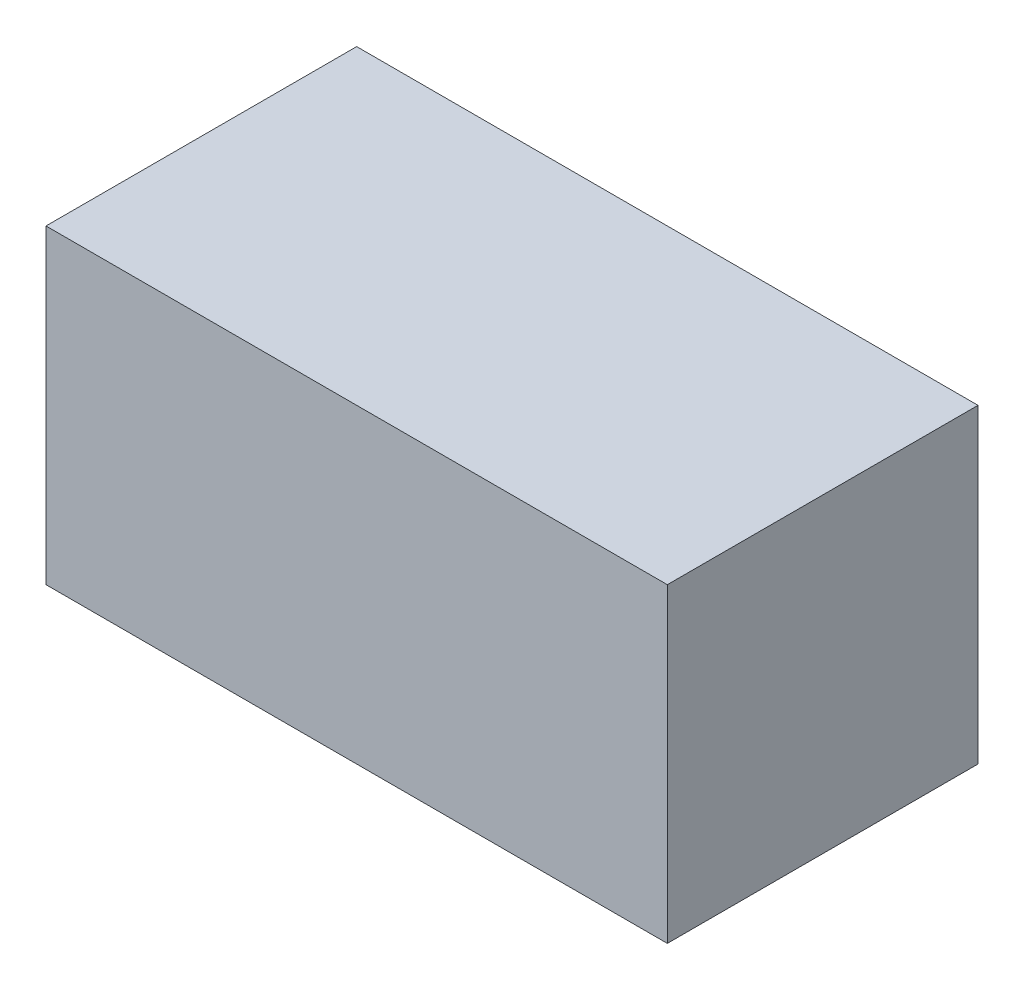
ISO-10303-21;
HEADER;
FILE_DESCRIPTION(('STEP AP214'),'2;1');
FILE_NAME('part.step','',(''),(''),'','','');
FILE_SCHEMA(('AUTOMOTIVE_DESIGN { 1 0 10303 214 1 1 1 1 }'));
ENDSEC;
DATA;
#1=APPLICATION_CONTEXT('core data for automotive mechanical design processes');
#2=APPLICATION_PROTOCOL_DEFINITION('international standard','automotive_design',2000,#1);
#3=PRODUCT_CONTEXT('',#1,'mechanical');
#4=PRODUCT('Part','Part','',(#3));
#5=PRODUCT_RELATED_PRODUCT_CATEGORY('part','',(#4));
#6=PRODUCT_DEFINITION_FORMATION('','',#4);
#7=PRODUCT_DEFINITION_CONTEXT('part definition',#1,'design');
#8=PRODUCT_DEFINITION('design','',#6,#7);
#9=PRODUCT_DEFINITION_SHAPE('','',#8);
#10=(LENGTH_UNIT() NAMED_UNIT(*) SI_UNIT(.MILLI.,.METRE.));
#11=(NAMED_UNIT(*) PLANE_ANGLE_UNIT() SI_UNIT($,.RADIAN.));
#12=(NAMED_UNIT(*) SI_UNIT($,.STERADIAN.) SOLID_ANGLE_UNIT());
#13=UNCERTAINTY_MEASURE_WITH_UNIT(LENGTH_MEASURE(1.E-05),#10,'distance_accuracy_value','');
#14=(GEOMETRIC_REPRESENTATION_CONTEXT(3) GLOBAL_UNCERTAINTY_ASSIGNED_CONTEXT((#13)) GLOBAL_UNIT_ASSIGNED_CONTEXT((#10,
#11,#12)) REPRESENTATION_CONTEXT('',''));
#15=CARTESIAN_POINT('',(0.,0.,0.));
#16=DIRECTION('',(0.,0.,1.));
#17=DIRECTION('',(1.,0.,0.));
#18=AXIS2_PLACEMENT_3D('',#15,#16,#17);
#19=CARTESIAN_POINT('',(-2.01024308289651,1.0477984000196,1.));
#20=DIRECTION('',(1.,0.,0.));
#21=DIRECTION('',(0.,0.,-1.));
#22=AXIS2_PLACEMENT_3D('',#19,#20,#21);
#23=PLANE('',#22);
#24=DIRECTION('',(0.,-1.,0.));
#25=VECTOR('',#24,1.);
#26=CARTESIAN_POINT('',(-2.01024308289651,1.0477984000196,0.));
#27=LINE('',#26,#25);
#28=CARTESIAN_POINT('',(-2.01024308289651,2.0477984000196,0.));
#29=VERTEX_POINT('',#28);
#30=CARTESIAN_POINT('',(-2.01024308289651,1.0477984000196,0.));
#31=VERTEX_POINT('',#30);
#32=EDGE_CURVE('E96',#29,#31,#27,.T.);
#33=ORIENTED_EDGE('',*,*,#32,.T.);
#34=DIRECTION('',(0.,0.,-1.));
#35=VECTOR('',#34,1.);
#36=CARTESIAN_POINT('',(-2.01024308289651,1.0477984000196,1.));
#37=LINE('',#36,#35);
#38=CARTESIAN_POINT('',(-2.01024308289651,1.0477984000196,1.));
#39=VERTEX_POINT('',#38);
#40=EDGE_CURVE('E11',#39,#31,#37,.T.);
#41=ORIENTED_EDGE('',*,*,#40,.F.);
#42=DIRECTION('',(0.,-1.,0.));
#43=VECTOR('',#42,1.);
#44=CARTESIAN_POINT('',(-2.01024308289651,1.0477984000196,1.));
#45=LINE('',#44,#43);
#46=CARTESIAN_POINT('',(-2.01024308289651,2.0477984000196,1.));
#47=VERTEX_POINT('',#46);
#48=EDGE_CURVE('E84',#47,#39,#45,.T.);
#49=ORIENTED_EDGE('',*,*,#48,.F.);
#50=DIRECTION('',(0.,0.,-1.));
#51=VECTOR('',#50,1.);
#52=CARTESIAN_POINT('',(-2.01024308289651,2.0477984000196,1.));
#53=LINE('',#52,#51);
#54=EDGE_CURVE('E92',#47,#29,#53,.T.);
#55=ORIENTED_EDGE('',*,*,#54,.T.);
#56=EDGE_LOOP('',(#33,#41,#49,#55));
#57=FACE_BOUND('',#56,.T.);
#58=ADVANCED_FACE('F33',(#57),#23,.F.);
#59=CARTESIAN_POINT('',(-0.0102430828965142,1.0477984000196,1.));
#60=DIRECTION('',(0.,1.,0.));
#61=DIRECTION('',(0.,0.,1.));
#62=AXIS2_PLACEMENT_3D('',#59,#60,#61);
#63=PLANE('',#62);
#64=DIRECTION('',(1.,0.,0.));
#65=VECTOR('',#64,1.);
#66=CARTESIAN_POINT('',(-0.0102430828965142,1.0477984000196,0.));
#67=LINE('',#66,#65);
#68=CARTESIAN_POINT('',(-0.0102430828965142,1.0477984000196,0.));
#69=VERTEX_POINT('',#68);
#70=EDGE_CURVE('E88',#31,#69,#67,.T.);
#71=ORIENTED_EDGE('',*,*,#70,.T.);
#72=DIRECTION('',(0.,0.,-1.));
#73=VECTOR('',#72,1.);
#74=CARTESIAN_POINT('',(-0.0102430828965142,1.0477984000196,1.));
#75=LINE('',#74,#73);
#76=CARTESIAN_POINT('',(-0.0102430828965142,1.0477984000196,1.));
#77=VERTEX_POINT('',#76);
#78=EDGE_CURVE('E41',#77,#69,#75,.T.);
#79=ORIENTED_EDGE('',*,*,#78,.F.);
#80=DIRECTION('',(1.,0.,0.));
#81=VECTOR('',#80,1.);
#82=CARTESIAN_POINT('',(-0.0102430828965142,1.0477984000196,1.));
#83=LINE('',#82,#81);
#84=EDGE_CURVE('E79',#39,#77,#83,.T.);
#85=ORIENTED_EDGE('',*,*,#84,.F.);
#86=ORIENTED_EDGE('',*,*,#40,.T.);
#87=EDGE_LOOP('',(#71,#79,#85,#86));
#88=FACE_BOUND('',#87,.T.);
#89=ADVANCED_FACE('F87',(#88),#63,.F.);
#90=CARTESIAN_POINT('',(-0.0102430828965144,2.0477984000196,1.));
#91=DIRECTION('',(-1.,0.,0.));
#92=DIRECTION('',(0.,-1.,0.));
#93=AXIS2_PLACEMENT_3D('',#90,#91,#92);
#94=PLANE('',#93);
#95=DIRECTION('',(0.,1.,0.));
#96=VECTOR('',#95,1.);
#97=CARTESIAN_POINT('',(-0.0102430828965144,2.0477984000196,0.));
#98=LINE('',#97,#96);
#99=CARTESIAN_POINT('',(-0.0102430828965144,2.0477984000196,0.));
#100=VERTEX_POINT('',#99);
#101=EDGE_CURVE('E66',#69,#100,#98,.T.);
#102=ORIENTED_EDGE('',*,*,#101,.T.);
#103=DIRECTION('',(0.,0.,-1.));
#104=VECTOR('',#103,1.);
#105=CARTESIAN_POINT('',(-0.0102430828965144,2.0477984000196,1.));
#106=LINE('',#105,#104);
#107=CARTESIAN_POINT('',(-0.0102430828965144,2.0477984000196,1.));
#108=VERTEX_POINT('',#107);
#109=EDGE_CURVE('E89',#108,#100,#106,.T.);
#110=ORIENTED_EDGE('',*,*,#109,.F.);
#111=DIRECTION('',(0.,1.,0.));
#112=VECTOR('',#111,1.);
#113=CARTESIAN_POINT('',(-0.0102430828965144,2.0477984000196,1.));
#114=LINE('',#113,#112);
#115=EDGE_CURVE('E82',#77,#108,#114,.T.);
#116=ORIENTED_EDGE('',*,*,#115,.F.);
#117=ORIENTED_EDGE('',*,*,#78,.T.);
#118=EDGE_LOOP('',(#102,#110,#116,#117));
#119=FACE_BOUND('',#118,.T.);
#120=ADVANCED_FACE('F90',(#119),#94,.F.);
#121=CARTESIAN_POINT('',(-2.01024308289651,2.0477984000196,1.));
#122=DIRECTION('',(0.,-1.,0.));
#123=DIRECTION('',(0.,0.,-1.));
#124=AXIS2_PLACEMENT_3D('',#121,#122,#123);
#125=PLANE('',#124);
#126=DIRECTION('',(-1.,0.,0.));
#127=VECTOR('',#126,1.);
#128=CARTESIAN_POINT('',(-2.01024308289651,2.0477984000196,0.));
#129=LINE('',#128,#127);
#130=EDGE_CURVE('E72',#100,#29,#129,.T.);
#131=ORIENTED_EDGE('',*,*,#130,.T.);
#132=ORIENTED_EDGE('',*,*,#54,.F.);
#133=DIRECTION('',(-1.,0.,0.));
#134=VECTOR('',#133,1.);
#135=CARTESIAN_POINT('',(-2.01024308289651,2.0477984000196,1.));
#136=LINE('',#135,#134);
#137=EDGE_CURVE('E49',#108,#47,#136,.T.);
#138=ORIENTED_EDGE('',*,*,#137,.F.);
#139=ORIENTED_EDGE('',*,*,#109,.T.);
#140=EDGE_LOOP('',(#131,#132,#138,#139));
#141=FACE_BOUND('',#140,.T.);
#142=ADVANCED_FACE('F103',(#141),#125,.F.);
#143=CARTESIAN_POINT('',(0.,0.,1.));
#144=DIRECTION('',(0.,0.,-1.));
#145=DIRECTION('',(-1.,0.,0.));
#146=AXIS2_PLACEMENT_3D('',#143,#144,#145);
#147=PLANE('',#146);
#148=ORIENTED_EDGE('',*,*,#48,.T.);
#149=ORIENTED_EDGE('',*,*,#84,.T.);
#150=ORIENTED_EDGE('',*,*,#115,.T.);
#151=ORIENTED_EDGE('',*,*,#137,.T.);
#152=EDGE_LOOP('',(#148,#149,#150,#151));
#153=FACE_BOUND('',#152,.T.);
#154=ADVANCED_FACE('F80',(#153),#147,.F.);
#155=CARTESIAN_POINT('',(0.,0.,0.));
#156=DIRECTION('',(0.,0.,-1.));
#157=DIRECTION('',(-1.,0.,0.));
#158=AXIS2_PLACEMENT_3D('',#155,#156,#157);
#159=PLANE('',#158);
#160=ORIENTED_EDGE('',*,*,#32,.F.);
#161=ORIENTED_EDGE('',*,*,#130,.F.);
#162=ORIENTED_EDGE('',*,*,#101,.F.);
#163=ORIENTED_EDGE('',*,*,#70,.F.);
#164=EDGE_LOOP('',(#160,#161,#162,#163));
#165=FACE_BOUND('',#164,.T.);
#166=ADVANCED_FACE('F106',(#165),#159,.T.);
#167=CLOSED_SHELL('',(#58,#89,#120,#142,#154,#166));
#168=MANIFOLD_SOLID_BREP('B2',#167);
#169=ADVANCED_BREP_SHAPE_REPRESENTATION('',(#18,#168),#14);
#170=SHAPE_DEFINITION_REPRESENTATION(#9,#169);
ENDSEC;
END-ISO-10303-21;
